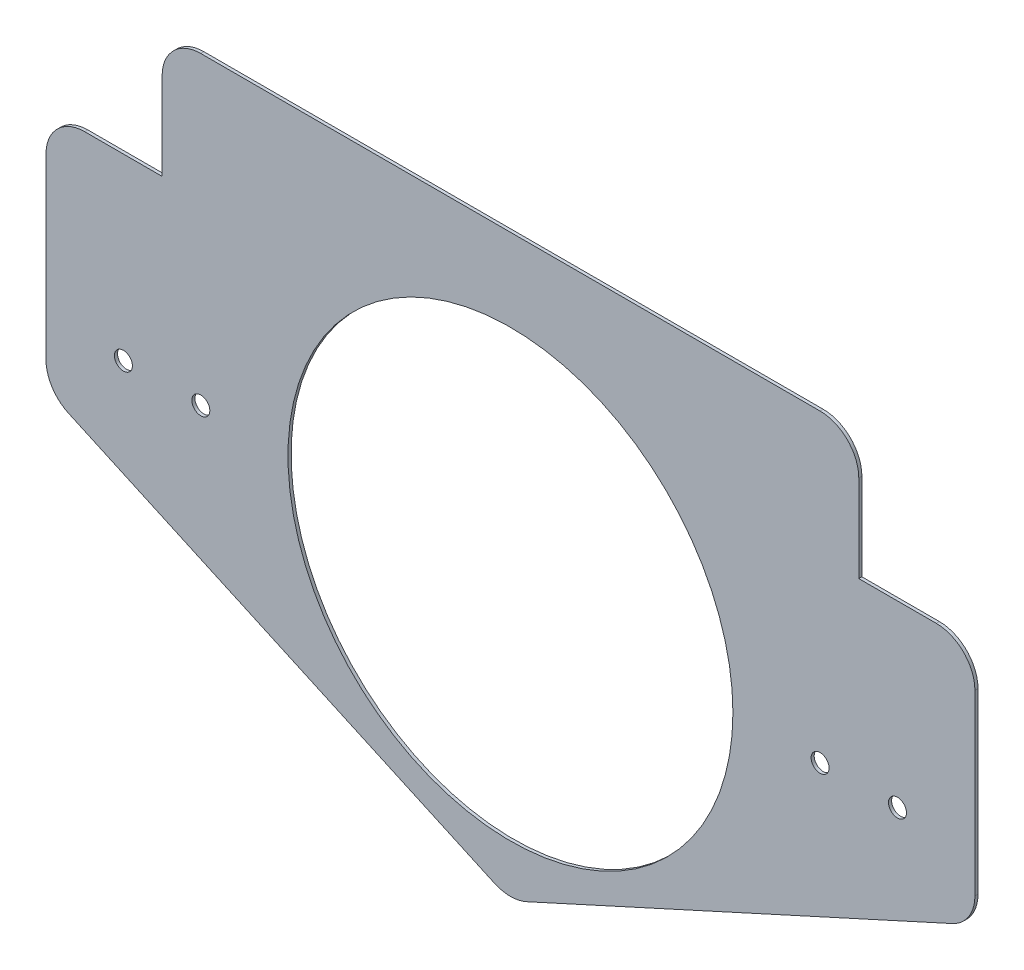
ISO-10303-21;
HEADER;
FILE_DESCRIPTION(('STEP AP214'),'2;1');
FILE_NAME('part.step','',(''),(''),'','','');
FILE_SCHEMA(('AUTOMOTIVE_DESIGN { 1 0 10303 214 1 1 1 1 }'));
ENDSEC;
DATA;
#1=APPLICATION_CONTEXT('core data for automotive mechanical design processes');
#2=APPLICATION_PROTOCOL_DEFINITION('international standard','automotive_design',2000,#1);
#3=PRODUCT_CONTEXT('',#1,'mechanical');
#4=PRODUCT('Part','Part','',(#3));
#5=PRODUCT_RELATED_PRODUCT_CATEGORY('part','',(#4));
#6=PRODUCT_DEFINITION_FORMATION('','',#4);
#7=PRODUCT_DEFINITION_CONTEXT('part definition',#1,'design');
#8=PRODUCT_DEFINITION('design','',#6,#7);
#9=PRODUCT_DEFINITION_SHAPE('','',#8);
#10=(LENGTH_UNIT() NAMED_UNIT(*) SI_UNIT(.MILLI.,.METRE.));
#11=(NAMED_UNIT(*) PLANE_ANGLE_UNIT() SI_UNIT($,.RADIAN.));
#12=(NAMED_UNIT(*) SI_UNIT($,.STERADIAN.) SOLID_ANGLE_UNIT());
#13=UNCERTAINTY_MEASURE_WITH_UNIT(LENGTH_MEASURE(1.E-05),#10,'distance_accuracy_value','');
#14=(GEOMETRIC_REPRESENTATION_CONTEXT(3) GLOBAL_UNCERTAINTY_ASSIGNED_CONTEXT((#13)) GLOBAL_UNIT_ASSIGNED_CONTEXT((#10,
#11,#12)) REPRESENTATION_CONTEXT('',''));
#15=CARTESIAN_POINT('',(0.,0.,0.));
#16=DIRECTION('',(0.,0.,1.));
#17=DIRECTION('',(1.,0.,0.));
#18=AXIS2_PLACEMENT_3D('',#15,#16,#17);
#19=CARTESIAN_POINT('',(16.9760784792945,-37.2669482109484,0.508));
#20=DIRECTION('',(-0.414542633889756,0.910029892194616,0.));
#21=DIRECTION('',(-0.910029892194616,-0.414542633889756,0.));
#22=AXIS2_PLACEMENT_3D('',#19,#20,#21);
#23=PLANE('',#22);
#24=DIRECTION('',(0.910029892194616,0.414542633889756,0.));
#25=VECTOR('',#24,1.);
#26=CARTESIAN_POINT('',(16.9760784792945,-37.2669482109484,0.));
#27=LINE('',#26,#25);
#28=CARTESIAN_POINT('',(2.63234572519997,-43.8008970478966,0.));
#29=VERTEX_POINT('',#28);
#30=CARTESIAN_POINT('',(72.4823457251999,-11.9823785293785,0.));
#31=VERTEX_POINT('',#30);
#32=EDGE_CURVE('E236',#29,#31,#27,.T.);
#33=ORIENTED_EDGE('',*,*,#32,.T.);
#34=DIRECTION('',(0.,0.,-1.));
#35=VECTOR('',#34,1.);
#36=CARTESIAN_POINT('',(72.4823457251999,-11.9823785293785,0.508));
#37=LINE('',#36,#35);
#38=CARTESIAN_POINT('',(72.4823457251999,-11.9823785293785,0.508));
#39=VERTEX_POINT('',#38);
#40=EDGE_CURVE('E354',#31,#39,#37,.F.);
#41=ORIENTED_EDGE('',*,*,#40,.T.);
#42=DIRECTION('',(0.910029892194616,0.414542633889756,0.));
#43=VECTOR('',#42,1.);
#44=CARTESIAN_POINT('',(16.9760784792945,-37.2669482109484,0.508));
#45=LINE('',#44,#43);
#46=CARTESIAN_POINT('',(2.63234572519997,-43.8008970478966,0.508));
#47=VERTEX_POINT('',#46);
#48=EDGE_CURVE('E196',#47,#39,#45,.T.);
#49=ORIENTED_EDGE('',*,*,#48,.F.);
#50=DIRECTION('',(0.,0.,-1.));
#51=VECTOR('',#50,1.);
#52=CARTESIAN_POINT('',(2.63234572519997,-43.8008970478966,0.));
#53=LINE('',#52,#51);
#54=EDGE_CURVE('E350',#47,#29,#53,.T.);
#55=ORIENTED_EDGE('',*,*,#54,.T.);
#56=EDGE_LOOP('',(#33,#41,#49,#55));
#57=FACE_BOUND('',#56,.T.);
#58=ADVANCED_FACE('F45',(#57),#23,.F.);
#59=CARTESIAN_POINT('',(76.2,0.,0.508));
#60=DIRECTION('',(1.,0.,0.));
#61=DIRECTION('',(0.,1.,0.));
#62=AXIS2_PLACEMENT_3D('',#59,#60,#61);
#63=PLANE('',#62);
#64=DIRECTION('',(0.,-1.,0.));
#65=VECTOR('',#64,1.);
#66=CARTESIAN_POINT('',(76.2,0.,0.508));
#67=LINE('',#66,#65);
#68=CARTESIAN_POINT('',(76.1999999999999,23.0166666666667,0.508));
#69=VERTEX_POINT('',#68);
#70=CARTESIAN_POINT('',(76.2,-6.20368871394266,0.508));
#71=VERTEX_POINT('',#70);
#72=EDGE_CURVE('E192',#69,#71,#67,.T.);
#73=ORIENTED_EDGE('',*,*,#72,.T.);
#74=DIRECTION('',(0.,0.,-1.));
#75=VECTOR('',#74,1.);
#76=CARTESIAN_POINT('',(76.2,-6.20368871394266,0.));
#77=LINE('',#76,#75);
#78=CARTESIAN_POINT('',(76.2,-6.20368871394266,0.));
#79=VERTEX_POINT('',#78);
#80=EDGE_CURVE('E346',#71,#79,#77,.T.);
#81=ORIENTED_EDGE('',*,*,#80,.T.);
#82=DIRECTION('',(0.,-1.,0.));
#83=VECTOR('',#82,1.);
#84=CARTESIAN_POINT('',(76.2,0.,0.));
#85=LINE('',#84,#83);
#86=CARTESIAN_POINT('',(76.1999999999999,23.0166666666667,0.));
#87=VERTEX_POINT('',#86);
#88=EDGE_CURVE('E240',#87,#79,#85,.T.);
#89=ORIENTED_EDGE('',*,*,#88,.F.);
#90=DIRECTION('',(0.,0.,-1.));
#91=VECTOR('',#90,1.);
#92=CARTESIAN_POINT('',(76.1999999999999,23.0166666666667,0.508));
#93=LINE('',#92,#91);
#94=EDGE_CURVE('E343',#87,#69,#93,.F.);
#95=ORIENTED_EDGE('',*,*,#94,.T.);
#96=EDGE_LOOP('',(#73,#81,#89,#95));
#97=FACE_BOUND('',#96,.T.);
#98=ADVANCED_FACE('F420',(#97),#63,.T.);
#99=CARTESIAN_POINT('',(0.,29.3666666666665,0.508));
#100=DIRECTION('',(0.,1.,0.));
#101=DIRECTION('',(-1.,0.,0.));
#102=AXIS2_PLACEMENT_3D('',#99,#100,#101);
#103=PLANE('',#102);
#104=DIRECTION('',(1.,0.,0.));
#105=VECTOR('',#104,1.);
#106=CARTESIAN_POINT('',(0.,29.3666666666665,0.508));
#107=LINE('',#106,#105);
#108=CARTESIAN_POINT('',(57.15,29.3666666666667,0.508));
#109=VERTEX_POINT('',#108);
#110=CARTESIAN_POINT('',(69.8499999999999,29.3666666666667,0.508));
#111=VERTEX_POINT('',#110);
#112=EDGE_CURVE('E172',#109,#111,#107,.T.);
#113=ORIENTED_EDGE('',*,*,#112,.T.);
#114=DIRECTION('',(0.,0.,-1.));
#115=VECTOR('',#114,1.);
#116=CARTESIAN_POINT('',(69.8499999999999,29.3666666666667,0.508));
#117=LINE('',#116,#115);
#118=CARTESIAN_POINT('',(69.8499999999999,29.3666666666667,0.));
#119=VERTEX_POINT('',#118);
#120=EDGE_CURVE('E357',#111,#119,#117,.T.);
#121=ORIENTED_EDGE('',*,*,#120,.T.);
#122=DIRECTION('',(1.,0.,0.));
#123=VECTOR('',#122,1.);
#124=CARTESIAN_POINT('',(0.,29.3666666666665,0.));
#125=LINE('',#124,#123);
#126=CARTESIAN_POINT('',(57.15,29.3666666666667,0.));
#127=VERTEX_POINT('',#126);
#128=EDGE_CURVE('E180',#127,#119,#125,.T.);
#129=ORIENTED_EDGE('',*,*,#128,.F.);
#130=DIRECTION('',(0.,0.,-1.));
#131=VECTOR('',#130,1.);
#132=CARTESIAN_POINT('',(57.15,29.3666666666667,0.508));
#133=LINE('',#132,#131);
#134=EDGE_CURVE('E165',#109,#127,#133,.T.);
#135=ORIENTED_EDGE('',*,*,#134,.F.);
#136=EDGE_LOOP('',(#113,#121,#129,#135));
#137=FACE_BOUND('',#136,.T.);
#138=ADVANCED_FACE('F176',(#137),#103,.T.);
#139=CARTESIAN_POINT('',(57.15,0.,0.508));
#140=DIRECTION('',(1.,0.,0.));
#141=DIRECTION('',(0.,1.,0.));
#142=AXIS2_PLACEMENT_3D('',#139,#140,#141);
#143=PLANE('',#142);
#144=DIRECTION('',(0.,-1.,0.));
#145=VECTOR('',#144,1.);
#146=CARTESIAN_POINT('',(57.15,0.,0.));
#147=LINE('',#146,#145);
#148=CARTESIAN_POINT('',(57.15,43.65,0.));
#149=VERTEX_POINT('',#148);
#150=EDGE_CURVE('E246',#149,#127,#147,.T.);
#151=ORIENTED_EDGE('',*,*,#150,.F.);
#152=DIRECTION('',(0.,0.,-1.));
#153=VECTOR('',#152,1.);
#154=CARTESIAN_POINT('',(57.15,43.65,0.508));
#155=LINE('',#154,#153);
#156=CARTESIAN_POINT('',(57.15,43.65,0.508));
#157=VERTEX_POINT('',#156);
#158=EDGE_CURVE('E11',#149,#157,#155,.F.);
#159=ORIENTED_EDGE('',*,*,#158,.T.);
#160=DIRECTION('',(0.,-1.,0.));
#161=VECTOR('',#160,1.);
#162=CARTESIAN_POINT('',(57.15,0.,0.508));
#163=LINE('',#162,#161);
#164=EDGE_CURVE('E161',#157,#109,#163,.T.);
#165=ORIENTED_EDGE('',*,*,#164,.T.);
#166=ORIENTED_EDGE('',*,*,#134,.T.);
#167=EDGE_LOOP('',(#151,#159,#165,#166));
#168=FACE_BOUND('',#167,.T.);
#169=ADVANCED_FACE('F164',(#168),#143,.T.);
#170=CARTESIAN_POINT('',(0.,50.,0.508));
#171=DIRECTION('',(0.,1.,0.));
#172=DIRECTION('',(-1.,0.,0.));
#173=AXIS2_PLACEMENT_3D('',#170,#171,#172);
#174=PLANE('',#173);
#175=DIRECTION('',(1.,0.,0.));
#176=VECTOR('',#175,1.);
#177=CARTESIAN_POINT('',(0.,50.,0.));
#178=LINE('',#177,#176);
#179=CARTESIAN_POINT('',(-50.8,50.,0.));
#180=VERTEX_POINT('',#179);
#181=CARTESIAN_POINT('',(50.8,50.,0.));
#182=VERTEX_POINT('',#181);
#183=EDGE_CURVE('E249',#180,#182,#178,.T.);
#184=ORIENTED_EDGE('',*,*,#183,.F.);
#185=DIRECTION('',(0.,0.,-1.));
#186=VECTOR('',#185,1.);
#187=CARTESIAN_POINT('',(-50.8,50.,0.508));
#188=LINE('',#187,#186);
#189=CARTESIAN_POINT('',(-50.8,50.,0.508));
#190=VERTEX_POINT('',#189);
#191=EDGE_CURVE('E54',#180,#190,#188,.F.);
#192=ORIENTED_EDGE('',*,*,#191,.T.);
#193=DIRECTION('',(1.,0.,0.));
#194=VECTOR('',#193,1.);
#195=CARTESIAN_POINT('',(0.,50.,0.508));
#196=LINE('',#195,#194);
#197=CARTESIAN_POINT('',(50.8,50.,0.508));
#198=VERTEX_POINT('',#197);
#199=EDGE_CURVE('E171',#190,#198,#196,.T.);
#200=ORIENTED_EDGE('',*,*,#199,.T.);
#201=DIRECTION('',(0.,0.,-1.));
#202=VECTOR('',#201,1.);
#203=CARTESIAN_POINT('',(50.8,50.,0.508));
#204=LINE('',#203,#202);
#205=EDGE_CURVE('E366',#198,#182,#204,.T.);
#206=ORIENTED_EDGE('',*,*,#205,.T.);
#207=EDGE_LOOP('',(#184,#192,#200,#206));
#208=FACE_BOUND('',#207,.T.);
#209=ADVANCED_FACE('F373',(#208),#174,.T.);
#210=CARTESIAN_POINT('',(-57.15,0.,0.508));
#211=DIRECTION('',(1.,0.,0.));
#212=DIRECTION('',(0.,1.,0.));
#213=AXIS2_PLACEMENT_3D('',#210,#211,#212);
#214=PLANE('',#213);
#215=DIRECTION('',(0.,-1.,0.));
#216=VECTOR('',#215,1.);
#217=CARTESIAN_POINT('',(-57.15,0.,0.508));
#218=LINE('',#217,#216);
#219=CARTESIAN_POINT('',(-57.15,43.65,0.508));
#220=VERTEX_POINT('',#219);
#221=CARTESIAN_POINT('',(-57.15,29.3666666666667,0.508));
#222=VERTEX_POINT('',#221);
#223=EDGE_CURVE('E203',#220,#222,#218,.T.);
#224=ORIENTED_EDGE('',*,*,#223,.F.);
#225=DIRECTION('',(0.,0.,-1.));
#226=VECTOR('',#225,1.);
#227=CARTESIAN_POINT('',(-57.15,43.65,0.));
#228=LINE('',#227,#226);
#229=CARTESIAN_POINT('',(-57.15,43.65,0.));
#230=VERTEX_POINT('',#229);
#231=EDGE_CURVE('E362',#220,#230,#228,.T.);
#232=ORIENTED_EDGE('',*,*,#231,.T.);
#233=DIRECTION('',(0.,-1.,0.));
#234=VECTOR('',#233,1.);
#235=CARTESIAN_POINT('',(-57.15,0.,0.));
#236=LINE('',#235,#234);
#237=CARTESIAN_POINT('',(-57.15,29.3666666666667,0.));
#238=VERTEX_POINT('',#237);
#239=EDGE_CURVE('E253',#230,#238,#236,.T.);
#240=ORIENTED_EDGE('',*,*,#239,.T.);
#241=DIRECTION('',(0.,0.,-1.));
#242=VECTOR('',#241,1.);
#243=CARTESIAN_POINT('',(-57.15,29.3666666666667,0.508));
#244=LINE('',#243,#242);
#245=EDGE_CURVE('E183',#222,#238,#244,.T.);
#246=ORIENTED_EDGE('',*,*,#245,.F.);
#247=EDGE_LOOP('',(#224,#232,#240,#246));
#248=FACE_BOUND('',#247,.T.);
#249=ADVANCED_FACE('F380',(#248),#214,.F.);
#250=CARTESIAN_POINT('',(0.,29.3666666666667,0.508));
#251=DIRECTION('',(0.,-1.,0.));
#252=DIRECTION('',(1.,0.,0.));
#253=AXIS2_PLACEMENT_3D('',#250,#251,#252);
#254=PLANE('',#253);
#255=DIRECTION('',(-1.,0.,0.));
#256=VECTOR('',#255,1.);
#257=CARTESIAN_POINT('',(0.,29.3666666666667,0.));
#258=LINE('',#257,#256);
#259=CARTESIAN_POINT('',(-69.8500000000001,29.3666666666667,0.));
#260=VERTEX_POINT('',#259);
#261=EDGE_CURVE('E256',#238,#260,#258,.T.);
#262=ORIENTED_EDGE('',*,*,#261,.T.);
#263=DIRECTION('',(0.,0.,-1.));
#264=VECTOR('',#263,1.);
#265=CARTESIAN_POINT('',(-69.8500000000001,29.3666666666667,0.508));
#266=LINE('',#265,#264);
#267=CARTESIAN_POINT('',(-69.8500000000001,29.3666666666667,0.508));
#268=VERTEX_POINT('',#267);
#269=EDGE_CURVE('E61',#260,#268,#266,.F.);
#270=ORIENTED_EDGE('',*,*,#269,.T.);
#271=DIRECTION('',(-1.,0.,0.));
#272=VECTOR('',#271,1.);
#273=CARTESIAN_POINT('',(0.,29.3666666666667,0.508));
#274=LINE('',#273,#272);
#275=EDGE_CURVE('E206',#222,#268,#274,.T.);
#276=ORIENTED_EDGE('',*,*,#275,.F.);
#277=ORIENTED_EDGE('',*,*,#245,.T.);
#278=EDGE_LOOP('',(#262,#270,#276,#277));
#279=FACE_BOUND('',#278,.T.);
#280=ADVANCED_FACE('F387',(#279),#254,.F.);
#281=CARTESIAN_POINT('',(-76.2,0.,0.508));
#282=DIRECTION('',(1.,0.,0.));
#283=DIRECTION('',(0.,1.,0.));
#284=AXIS2_PLACEMENT_3D('',#281,#282,#283);
#285=PLANE('',#284);
#286=DIRECTION('',(0.,-1.,0.));
#287=VECTOR('',#286,1.);
#288=CARTESIAN_POINT('',(-76.2,0.,0.));
#289=LINE('',#288,#287);
#290=CARTESIAN_POINT('',(-76.2,23.0166666666667,0.));
#291=VERTEX_POINT('',#290);
#292=CARTESIAN_POINT('',(-76.2,-6.20368871394265,0.));
#293=VERTEX_POINT('',#292);
#294=EDGE_CURVE('E259',#291,#293,#289,.T.);
#295=ORIENTED_EDGE('',*,*,#294,.T.);
#296=DIRECTION('',(0.,0.,-1.));
#297=VECTOR('',#296,1.);
#298=CARTESIAN_POINT('',(-76.2,-6.20368871394265,0.508));
#299=LINE('',#298,#297);
#300=CARTESIAN_POINT('',(-76.2,-6.20368871394265,0.508));
#301=VERTEX_POINT('',#300);
#302=EDGE_CURVE('E321',#293,#301,#299,.F.);
#303=ORIENTED_EDGE('',*,*,#302,.T.);
#304=DIRECTION('',(0.,-1.,0.));
#305=VECTOR('',#304,1.);
#306=CARTESIAN_POINT('',(-76.2,0.,0.508));
#307=LINE('',#306,#305);
#308=CARTESIAN_POINT('',(-76.2,23.0166666666667,0.508));
#309=VERTEX_POINT('',#308);
#310=EDGE_CURVE('E209',#309,#301,#307,.T.);
#311=ORIENTED_EDGE('',*,*,#310,.F.);
#312=DIRECTION('',(0.,0.,-1.));
#313=VECTOR('',#312,1.);
#314=CARTESIAN_POINT('',(-76.2,23.0166666666667,0.508));
#315=LINE('',#314,#313);
#316=EDGE_CURVE('E317',#309,#291,#315,.T.);
#317=ORIENTED_EDGE('',*,*,#316,.T.);
#318=EDGE_LOOP('',(#295,#303,#311,#317));
#319=FACE_BOUND('',#318,.T.);
#320=ADVANCED_FACE('F395',(#319),#285,.F.);
#321=CARTESIAN_POINT('',(-63.5,0.,0.508));
#322=DIRECTION('',(0.,0.,-1.));
#323=DIRECTION('',(-1.,0.,0.));
#324=AXIS2_PLACEMENT_3D('',#321,#322,#323);
#325=CYLINDRICAL_SURFACE('',#324,1.475);
#326=CARTESIAN_POINT('',(-63.5,0.,0.508));
#327=DIRECTION('',(0.,0.,1.));
#328=DIRECTION('',(1.,0.,0.));
#329=AXIS2_PLACEMENT_3D('',#326,#327,#328);
#330=CIRCLE('',#329,1.475);
#331=CARTESIAN_POINT('',(-62.025,0.,0.508));
#332=VERTEX_POINT('',#331);
#333=EDGE_CURVE('E228',#332,#332,#330,.T.);
#334=ORIENTED_EDGE('',*,*,#333,.T.);
#335=EDGE_LOOP('',(#334));
#336=FACE_BOUND('',#335,.T.);
#337=CARTESIAN_POINT('',(-63.5,0.,0.));
#338=DIRECTION('',(0.,0.,1.));
#339=DIRECTION('',(1.,0.,0.));
#340=AXIS2_PLACEMENT_3D('',#337,#338,#339);
#341=CIRCLE('',#340,1.475);
#342=CARTESIAN_POINT('',(-62.025,0.,0.));
#343=VERTEX_POINT('',#342);
#344=EDGE_CURVE('E279',#343,#343,#341,.T.);
#345=ORIENTED_EDGE('',*,*,#344,.F.);
#346=EDGE_LOOP('',(#345));
#347=FACE_BOUND('',#346,.T.);
#348=ADVANCED_FACE('F556',(#336,#347),#325,.F.);
#349=CARTESIAN_POINT('',(0.,0.,0.508));
#350=DIRECTION('',(0.,0.,-1.));
#351=DIRECTION('',(-1.,0.,0.));
#352=AXIS2_PLACEMENT_3D('',#349,#350,#351);
#353=CYLINDRICAL_SURFACE('',#352,36.5);
#354=CARTESIAN_POINT('',(0.,0.,0.508));
#355=DIRECTION('',(0.,0.,1.));
#356=DIRECTION('',(1.,0.,0.));
#357=AXIS2_PLACEMENT_3D('',#354,#355,#356);
#358=CIRCLE('',#357,36.5);
#359=CARTESIAN_POINT('',(36.5,0.,0.508));
#360=VERTEX_POINT('',#359);
#361=EDGE_CURVE('E224',#360,#360,#358,.T.);
#362=ORIENTED_EDGE('',*,*,#361,.T.);
#363=EDGE_LOOP('',(#362));
#364=FACE_BOUND('',#363,.T.);
#365=CARTESIAN_POINT('',(0.,0.,0.));
#366=DIRECTION('',(0.,0.,1.));
#367=DIRECTION('',(1.,0.,0.));
#368=AXIS2_PLACEMENT_3D('',#365,#366,#367);
#369=CIRCLE('',#368,36.5);
#370=CARTESIAN_POINT('',(36.5,0.,0.));
#371=VERTEX_POINT('',#370);
#372=EDGE_CURVE('E275',#371,#371,#369,.T.);
#373=ORIENTED_EDGE('',*,*,#372,.F.);
#374=EDGE_LOOP('',(#373));
#375=FACE_BOUND('',#374,.T.);
#376=ADVANCED_FACE('F546',(#364,#375),#353,.F.);
#377=CARTESIAN_POINT('',(-50.8,0.,0.508));
#378=DIRECTION('',(0.,0.,-1.));
#379=DIRECTION('',(-1.,0.,0.));
#380=AXIS2_PLACEMENT_3D('',#377,#378,#379);
#381=CYLINDRICAL_SURFACE('',#380,1.475);
#382=CARTESIAN_POINT('',(-50.8,0.,0.508));
#383=DIRECTION('',(0.,0.,1.));
#384=DIRECTION('',(1.,0.,0.));
#385=AXIS2_PLACEMENT_3D('',#382,#383,#384);
#386=CIRCLE('',#385,1.475);
#387=CARTESIAN_POINT('',(-49.325,0.,0.508));
#388=VERTEX_POINT('',#387);
#389=EDGE_CURVE('E220',#388,#388,#386,.T.);
#390=ORIENTED_EDGE('',*,*,#389,.T.);
#391=EDGE_LOOP('',(#390));
#392=FACE_BOUND('',#391,.T.);
#393=CARTESIAN_POINT('',(-50.8,0.,0.));
#394=DIRECTION('',(0.,0.,1.));
#395=DIRECTION('',(1.,0.,0.));
#396=AXIS2_PLACEMENT_3D('',#393,#394,#395);
#397=CIRCLE('',#396,1.475);
#398=CARTESIAN_POINT('',(-49.325,0.,0.));
#399=VERTEX_POINT('',#398);
#400=EDGE_CURVE('E271',#399,#399,#397,.T.);
#401=ORIENTED_EDGE('',*,*,#400,.F.);
#402=EDGE_LOOP('',(#401));
#403=FACE_BOUND('',#402,.T.);
#404=ADVANCED_FACE('F536',(#392,#403),#381,.F.);
#405=CARTESIAN_POINT('',(50.8,0.,0.508));
#406=DIRECTION('',(0.,0.,-1.));
#407=DIRECTION('',(-1.,0.,0.));
#408=AXIS2_PLACEMENT_3D('',#405,#406,#407);
#409=CYLINDRICAL_SURFACE('',#408,1.47500000000001);
#410=CARTESIAN_POINT('',(50.8,0.,0.508));
#411=DIRECTION('',(0.,0.,1.));
#412=DIRECTION('',(1.,0.,0.));
#413=AXIS2_PLACEMENT_3D('',#410,#411,#412);
#414=CIRCLE('',#413,1.47500000000001);
#415=CARTESIAN_POINT('',(52.275,0.,0.508));
#416=VERTEX_POINT('',#415);
#417=EDGE_CURVE('E216',#416,#416,#414,.T.);
#418=ORIENTED_EDGE('',*,*,#417,.T.);
#419=EDGE_LOOP('',(#418));
#420=FACE_BOUND('',#419,.T.);
#421=CARTESIAN_POINT('',(50.8,0.,0.));
#422=DIRECTION('',(0.,0.,1.));
#423=DIRECTION('',(1.,0.,0.));
#424=AXIS2_PLACEMENT_3D('',#421,#422,#423);
#425=CIRCLE('',#424,1.47500000000001);
#426=CARTESIAN_POINT('',(52.275,0.,0.));
#427=VERTEX_POINT('',#426);
#428=EDGE_CURVE('E267',#427,#427,#425,.T.);
#429=ORIENTED_EDGE('',*,*,#428,.F.);
#430=EDGE_LOOP('',(#429));
#431=FACE_BOUND('',#430,.T.);
#432=ADVANCED_FACE('F528',(#420,#431),#409,.F.);
#433=CARTESIAN_POINT('',(-16.9760784792945,-37.2669482109484,0.508));
#434=DIRECTION('',(-0.414542633889756,-0.910029892194616,0.));
#435=DIRECTION('',(0.910029892194616,-0.414542633889756,0.));
#436=AXIS2_PLACEMENT_3D('',#433,#434,#435);
#437=PLANE('',#436);
#438=DIRECTION('',(-0.910029892194616,0.414542633889756,0.));
#439=VECTOR('',#438,1.);
#440=CARTESIAN_POINT('',(-16.9760784792945,-37.2669482109484,0.508));
#441=LINE('',#440,#439);
#442=CARTESIAN_POINT('',(-2.63234572519993,-43.8008970478966,0.508));
#443=VERTEX_POINT('',#442);
#444=CARTESIAN_POINT('',(-72.4823457252,-11.9823785293784,0.508));
#445=VERTEX_POINT('',#444);
#446=EDGE_CURVE('E212',#443,#445,#441,.T.);
#447=ORIENTED_EDGE('',*,*,#446,.T.);
#448=DIRECTION('',(0.,0.,-1.));
#449=VECTOR('',#448,1.);
#450=CARTESIAN_POINT('',(-72.4823457252,-11.9823785293784,0.));
#451=LINE('',#450,#449);
#452=CARTESIAN_POINT('',(-72.4823457252,-11.9823785293784,0.));
#453=VERTEX_POINT('',#452);
#454=EDGE_CURVE('E292',#445,#453,#451,.T.);
#455=ORIENTED_EDGE('',*,*,#454,.T.);
#456=DIRECTION('',(-0.910029892194616,0.414542633889756,0.));
#457=VECTOR('',#456,1.);
#458=CARTESIAN_POINT('',(-16.9760784792945,-37.2669482109484,0.));
#459=LINE('',#458,#457);
#460=CARTESIAN_POINT('',(-2.63234572519993,-43.8008970478966,0.));
#461=VERTEX_POINT('',#460);
#462=EDGE_CURVE('E263',#461,#453,#459,.T.);
#463=ORIENTED_EDGE('',*,*,#462,.F.);
#464=DIRECTION('',(0.,0.,-1.));
#465=VECTOR('',#464,1.);
#466=CARTESIAN_POINT('',(-2.63234572519993,-43.8008970478966,0.508));
#467=LINE('',#466,#465);
#468=EDGE_CURVE('E182',#461,#443,#467,.F.);
#469=ORIENTED_EDGE('',*,*,#468,.T.);
#470=EDGE_LOOP('',(#447,#455,#463,#469));
#471=FACE_BOUND('',#470,.T.);
#472=ADVANCED_FACE('F403',(#471),#437,.T.);
#473=CARTESIAN_POINT('',(63.5,0.,0.508));
#474=DIRECTION('',(0.,0.,-1.));
#475=DIRECTION('',(-1.,0.,0.));
#476=AXIS2_PLACEMENT_3D('',#473,#474,#475);
#477=CYLINDRICAL_SURFACE('',#476,1.475);
#478=CARTESIAN_POINT('',(63.5,0.,0.508));
#479=DIRECTION('',(0.,0.,1.));
#480=DIRECTION('',(1.,0.,0.));
#481=AXIS2_PLACEMENT_3D('',#478,#479,#480);
#482=CIRCLE('',#481,1.475);
#483=CARTESIAN_POINT('',(64.975,0.,0.508));
#484=VERTEX_POINT('',#483);
#485=EDGE_CURVE('E232',#484,#484,#482,.T.);
#486=ORIENTED_EDGE('',*,*,#485,.T.);
#487=EDGE_LOOP('',(#486));
#488=FACE_BOUND('',#487,.T.);
#489=CARTESIAN_POINT('',(63.5,0.,0.));
#490=DIRECTION('',(0.,0.,1.));
#491=DIRECTION('',(1.,0.,0.));
#492=AXIS2_PLACEMENT_3D('',#489,#490,#491);
#493=CIRCLE('',#492,1.475);
#494=CARTESIAN_POINT('',(64.975,0.,0.));
#495=VERTEX_POINT('',#494);
#496=EDGE_CURVE('E283',#495,#495,#493,.T.);
#497=ORIENTED_EDGE('',*,*,#496,.F.);
#498=EDGE_LOOP('',(#497));
#499=FACE_BOUND('',#498,.T.);
#500=ADVANCED_FACE('F509',(#488,#499),#477,.F.);
#501=CARTESIAN_POINT('',(0.,0.,0.508));
#502=DIRECTION('',(0.,0.,1.));
#503=DIRECTION('',(1.,0.,0.));
#504=AXIS2_PLACEMENT_3D('',#501,#502,#503);
#505=PLANE('',#504);
#506=ORIENTED_EDGE('',*,*,#310,.T.);
#507=CARTESIAN_POINT('',(-69.85,-6.20368871394264,0.508));
#508=DIRECTION('',(0.,0.,1.));
#509=DIRECTION('',(1.,0.,0.));
#510=AXIS2_PLACEMENT_3D('',#507,#508,#509);
#511=CIRCLE('',#510,6.35);
#512=EDGE_CURVE('E340',#301,#445,#511,.T.);
#513=ORIENTED_EDGE('',*,*,#512,.T.);
#514=ORIENTED_EDGE('',*,*,#446,.F.);
#515=CARTESIAN_POINT('',(0.,-38.0222072324608,0.508));
#516=DIRECTION('',(0.,0.,1.));
#517=DIRECTION('',(1.,0.,0.));
#518=AXIS2_PLACEMENT_3D('',#515,#516,#517);
#519=CIRCLE('',#518,6.35);
#520=EDGE_CURVE('E334',#443,#47,#519,.T.);
#521=ORIENTED_EDGE('',*,*,#520,.T.);
#522=ORIENTED_EDGE('',*,*,#48,.T.);
#523=CARTESIAN_POINT('',(69.85,-6.20368871394267,0.508));
#524=DIRECTION('',(0.,0.,1.));
#525=DIRECTION('',(1.,0.,0.));
#526=AXIS2_PLACEMENT_3D('',#523,#524,#525);
#527=CIRCLE('',#526,6.35);
#528=EDGE_CURVE('E337',#39,#71,#527,.T.);
#529=ORIENTED_EDGE('',*,*,#528,.T.);
#530=ORIENTED_EDGE('',*,*,#72,.F.);
#531=CARTESIAN_POINT('',(69.8499999999999,23.0166666666667,0.508));
#532=DIRECTION('',(0.,0.,1.));
#533=DIRECTION('',(1.,0.,0.));
#534=AXIS2_PLACEMENT_3D('',#531,#532,#533);
#535=CIRCLE('',#534,6.35);
#536=EDGE_CURVE('E190',#69,#111,#535,.T.);
#537=ORIENTED_EDGE('',*,*,#536,.T.);
#538=ORIENTED_EDGE('',*,*,#112,.F.);
#539=ORIENTED_EDGE('',*,*,#164,.F.);
#540=CARTESIAN_POINT('',(50.8,43.65,0.508));
#541=DIRECTION('',(0.,0.,1.));
#542=DIRECTION('',(1.,0.,0.));
#543=AXIS2_PLACEMENT_3D('',#540,#541,#542);
#544=CIRCLE('',#543,6.35);
#545=EDGE_CURVE('E324',#157,#198,#544,.T.);
#546=ORIENTED_EDGE('',*,*,#545,.T.);
#547=ORIENTED_EDGE('',*,*,#199,.F.);
#548=CARTESIAN_POINT('',(-50.8,43.65,0.508));
#549=DIRECTION('',(0.,0.,1.));
#550=DIRECTION('',(1.,0.,0.));
#551=AXIS2_PLACEMENT_3D('',#548,#549,#550);
#552=CIRCLE('',#551,6.35);
#553=EDGE_CURVE('E69',#190,#220,#552,.T.);
#554=ORIENTED_EDGE('',*,*,#553,.T.);
#555=ORIENTED_EDGE('',*,*,#223,.T.);
#556=ORIENTED_EDGE('',*,*,#275,.T.);
#557=CARTESIAN_POINT('',(-69.8500000000001,23.0166666666667,0.508));
#558=DIRECTION('',(0.,0.,1.));
#559=DIRECTION('',(1.,0.,0.));
#560=AXIS2_PLACEMENT_3D('',#557,#558,#559);
#561=CIRCLE('',#560,6.35);
#562=EDGE_CURVE('E329',#268,#309,#561,.T.);
#563=ORIENTED_EDGE('',*,*,#562,.T.);
#564=EDGE_LOOP('',(#506,#513,#514,#521,#522,#529,#530,#537,#538,#539,#546,#547,#554,#555,#556,#563));
#565=FACE_BOUND('',#564,.T.);
#566=ORIENTED_EDGE('',*,*,#417,.F.);
#567=EDGE_LOOP('',(#566));
#568=FACE_BOUND('',#567,.T.);
#569=ORIENTED_EDGE('',*,*,#389,.F.);
#570=EDGE_LOOP('',(#569));
#571=FACE_BOUND('',#570,.T.);
#572=ORIENTED_EDGE('',*,*,#361,.F.);
#573=EDGE_LOOP('',(#572));
#574=FACE_BOUND('',#573,.T.);
#575=ORIENTED_EDGE('',*,*,#333,.F.);
#576=EDGE_LOOP('',(#575));
#577=FACE_BOUND('',#576,.T.);
#578=ORIENTED_EDGE('',*,*,#485,.F.);
#579=EDGE_LOOP('',(#578));
#580=FACE_BOUND('',#579,.T.);
#581=ADVANCED_FACE('F186',(#565,#568,#571,#574,#577,#580),#505,.T.);
#582=CARTESIAN_POINT('',(0.,0.,0.));
#583=DIRECTION('',(0.,0.,1.));
#584=DIRECTION('',(1.,0.,0.));
#585=AXIS2_PLACEMENT_3D('',#582,#583,#584);
#586=PLANE('',#585);
#587=ORIENTED_EDGE('',*,*,#462,.T.);
#588=CARTESIAN_POINT('',(-69.85,-6.20368871394264,0.));
#589=DIRECTION('',(0.,0.,1.));
#590=DIRECTION('',(1.,0.,0.));
#591=AXIS2_PLACEMENT_3D('',#588,#589,#590);
#592=CIRCLE('',#591,6.35);
#593=EDGE_CURVE('E314',#453,#293,#592,.F.);
#594=ORIENTED_EDGE('',*,*,#593,.T.);
#595=ORIENTED_EDGE('',*,*,#294,.F.);
#596=CARTESIAN_POINT('',(-69.8500000000001,23.0166666666667,0.));
#597=DIRECTION('',(0.,0.,1.));
#598=DIRECTION('',(1.,0.,0.));
#599=AXIS2_PLACEMENT_3D('',#596,#597,#598);
#600=CIRCLE('',#599,6.35);
#601=EDGE_CURVE('E302',#291,#260,#600,.F.);
#602=ORIENTED_EDGE('',*,*,#601,.T.);
#603=ORIENTED_EDGE('',*,*,#261,.F.);
#604=ORIENTED_EDGE('',*,*,#239,.F.);
#605=CARTESIAN_POINT('',(-50.8,43.65,0.));
#606=DIRECTION('',(0.,0.,1.));
#607=DIRECTION('',(1.,0.,0.));
#608=AXIS2_PLACEMENT_3D('',#605,#606,#607);
#609=CIRCLE('',#608,6.35);
#610=EDGE_CURVE('E299',#230,#180,#609,.F.);
#611=ORIENTED_EDGE('',*,*,#610,.T.);
#612=ORIENTED_EDGE('',*,*,#183,.T.);
#613=CARTESIAN_POINT('',(50.8,43.65,0.));
#614=DIRECTION('',(0.,0.,1.));
#615=DIRECTION('',(1.,0.,0.));
#616=AXIS2_PLACEMENT_3D('',#613,#614,#615);
#617=CIRCLE('',#616,6.35);
#618=EDGE_CURVE('E296',#182,#149,#617,.F.);
#619=ORIENTED_EDGE('',*,*,#618,.T.);
#620=ORIENTED_EDGE('',*,*,#150,.T.);
#621=ORIENTED_EDGE('',*,*,#128,.T.);
#622=CARTESIAN_POINT('',(69.8499999999999,23.0166666666667,0.));
#623=DIRECTION('',(0.,0.,1.));
#624=DIRECTION('',(1.,0.,0.));
#625=AXIS2_PLACEMENT_3D('',#622,#623,#624);
#626=CIRCLE('',#625,6.35);
#627=EDGE_CURVE('E305',#119,#87,#626,.F.);
#628=ORIENTED_EDGE('',*,*,#627,.T.);
#629=ORIENTED_EDGE('',*,*,#88,.T.);
#630=CARTESIAN_POINT('',(69.85,-6.20368871394267,0.));
#631=DIRECTION('',(0.,0.,1.));
#632=DIRECTION('',(1.,0.,0.));
#633=AXIS2_PLACEMENT_3D('',#630,#631,#632);
#634=CIRCLE('',#633,6.35);
#635=EDGE_CURVE('E311',#79,#31,#634,.F.);
#636=ORIENTED_EDGE('',*,*,#635,.T.);
#637=ORIENTED_EDGE('',*,*,#32,.F.);
#638=CARTESIAN_POINT('',(0.,-38.0222072324608,0.));
#639=DIRECTION('',(0.,0.,1.));
#640=DIRECTION('',(1.,0.,0.));
#641=AXIS2_PLACEMENT_3D('',#638,#639,#640);
#642=CIRCLE('',#641,6.35);
#643=EDGE_CURVE('E308',#29,#461,#642,.F.);
#644=ORIENTED_EDGE('',*,*,#643,.T.);
#645=EDGE_LOOP('',(#587,#594,#595,#602,#603,#604,#611,#612,#619,#620,#621,#628,#629,#636,#637,#644));
#646=FACE_BOUND('',#645,.T.);
#647=ORIENTED_EDGE('',*,*,#428,.T.);
#648=EDGE_LOOP('',(#647));
#649=FACE_BOUND('',#648,.T.);
#650=ORIENTED_EDGE('',*,*,#400,.T.);
#651=EDGE_LOOP('',(#650));
#652=FACE_BOUND('',#651,.T.);
#653=ORIENTED_EDGE('',*,*,#372,.T.);
#654=EDGE_LOOP('',(#653));
#655=FACE_BOUND('',#654,.T.);
#656=ORIENTED_EDGE('',*,*,#344,.T.);
#657=EDGE_LOOP('',(#656));
#658=FACE_BOUND('',#657,.T.);
#659=ORIENTED_EDGE('',*,*,#496,.T.);
#660=EDGE_LOOP('',(#659));
#661=FACE_BOUND('',#660,.T.);
#662=ADVANCED_FACE('F384',(#646,#649,#652,#655,#658,#661),#586,.F.);
#663=CARTESIAN_POINT('',(-69.85,-6.20368871394264,0.508));
#664=DIRECTION('',(0.,0.,1.));
#665=DIRECTION('',(1.,0.,0.));
#666=AXIS2_PLACEMENT_3D('',#663,#664,#665);
#667=CYLINDRICAL_SURFACE('',#666,6.35);
#668=ORIENTED_EDGE('',*,*,#512,.F.);
#669=ORIENTED_EDGE('',*,*,#302,.F.);
#670=ORIENTED_EDGE('',*,*,#593,.F.);
#671=ORIENTED_EDGE('',*,*,#454,.F.);
#672=EDGE_LOOP('',(#668,#669,#670,#671));
#673=FACE_BOUND('',#672,.T.);
#674=ADVANCED_FACE('F398',(#673),#667,.T.);
#675=CARTESIAN_POINT('',(69.85,-6.20368871394267,0.508));
#676=DIRECTION('',(0.,0.,1.));
#677=DIRECTION('',(1.,0.,0.));
#678=AXIS2_PLACEMENT_3D('',#675,#676,#677);
#679=CYLINDRICAL_SURFACE('',#678,6.35);
#680=ORIENTED_EDGE('',*,*,#528,.F.);
#681=ORIENTED_EDGE('',*,*,#40,.F.);
#682=ORIENTED_EDGE('',*,*,#635,.F.);
#683=ORIENTED_EDGE('',*,*,#80,.F.);
#684=EDGE_LOOP('',(#680,#681,#682,#683));
#685=FACE_BOUND('',#684,.T.);
#686=ADVANCED_FACE('F417',(#685),#679,.T.);
#687=CARTESIAN_POINT('',(0.,-38.0222072324608,0.508));
#688=DIRECTION('',(0.,0.,1.));
#689=DIRECTION('',(1.,0.,0.));
#690=AXIS2_PLACEMENT_3D('',#687,#688,#689);
#691=CYLINDRICAL_SURFACE('',#690,6.35);
#692=ORIENTED_EDGE('',*,*,#520,.F.);
#693=ORIENTED_EDGE('',*,*,#468,.F.);
#694=ORIENTED_EDGE('',*,*,#643,.F.);
#695=ORIENTED_EDGE('',*,*,#54,.F.);
#696=EDGE_LOOP('',(#692,#693,#694,#695));
#697=FACE_BOUND('',#696,.T.);
#698=ADVANCED_FACE('F407',(#697),#691,.T.);
#699=CARTESIAN_POINT('',(69.8499999999999,23.0166666666667,0.508));
#700=DIRECTION('',(0.,0.,-1.));
#701=DIRECTION('',(-1.,0.,0.));
#702=AXIS2_PLACEMENT_3D('',#699,#700,#701);
#703=CYLINDRICAL_SURFACE('',#702,6.35);
#704=ORIENTED_EDGE('',*,*,#536,.F.);
#705=ORIENTED_EDGE('',*,*,#94,.F.);
#706=ORIENTED_EDGE('',*,*,#627,.F.);
#707=ORIENTED_EDGE('',*,*,#120,.F.);
#708=EDGE_LOOP('',(#704,#705,#706,#707));
#709=FACE_BOUND('',#708,.T.);
#710=ADVANCED_FACE('F424',(#709),#703,.T.);
#711=CARTESIAN_POINT('',(-69.8500000000001,23.0166666666667,0.508));
#712=DIRECTION('',(0.,0.,-1.));
#713=DIRECTION('',(-1.,0.,0.));
#714=AXIS2_PLACEMENT_3D('',#711,#712,#713);
#715=CYLINDRICAL_SURFACE('',#714,6.35);
#716=ORIENTED_EDGE('',*,*,#562,.F.);
#717=ORIENTED_EDGE('',*,*,#269,.F.);
#718=ORIENTED_EDGE('',*,*,#601,.F.);
#719=ORIENTED_EDGE('',*,*,#316,.F.);
#720=EDGE_LOOP('',(#716,#717,#718,#719));
#721=FACE_BOUND('',#720,.T.);
#722=ADVANCED_FACE('F390',(#721),#715,.T.);
#723=CARTESIAN_POINT('',(-50.8,43.65,0.508));
#724=DIRECTION('',(0.,0.,1.));
#725=DIRECTION('',(1.,0.,0.));
#726=AXIS2_PLACEMENT_3D('',#723,#724,#725);
#727=CYLINDRICAL_SURFACE('',#726,6.35);
#728=ORIENTED_EDGE('',*,*,#553,.F.);
#729=ORIENTED_EDGE('',*,*,#191,.F.);
#730=ORIENTED_EDGE('',*,*,#610,.F.);
#731=ORIENTED_EDGE('',*,*,#231,.F.);
#732=EDGE_LOOP('',(#728,#729,#730,#731));
#733=FACE_BOUND('',#732,.T.);
#734=ADVANCED_FACE('F377',(#733),#727,.T.);
#735=CARTESIAN_POINT('',(50.8,43.65,0.508));
#736=DIRECTION('',(0.,0.,-1.));
#737=DIRECTION('',(-1.,0.,0.));
#738=AXIS2_PLACEMENT_3D('',#735,#736,#737);
#739=CYLINDRICAL_SURFACE('',#738,6.35);
#740=ORIENTED_EDGE('',*,*,#545,.F.);
#741=ORIENTED_EDGE('',*,*,#158,.F.);
#742=ORIENTED_EDGE('',*,*,#618,.F.);
#743=ORIENTED_EDGE('',*,*,#205,.F.);
#744=EDGE_LOOP('',(#740,#741,#742,#743));
#745=FACE_BOUND('',#744,.T.);
#746=ADVANCED_FACE('F47',(#745),#739,.T.);
#747=CLOSED_SHELL('',(#58,#98,#138,#169,#209,#249,#280,#320,#348,#376,#404,#432,#472,#500,#581,
#662,#674,#686,#698,#710,#722,#734,#746));
#748=MANIFOLD_SOLID_BREP('B2',#747);
#749=ADVANCED_BREP_SHAPE_REPRESENTATION('',(#18,#748),#14);
#750=SHAPE_DEFINITION_REPRESENTATION(#9,#749);
ENDSEC;
END-ISO-10303-21;
